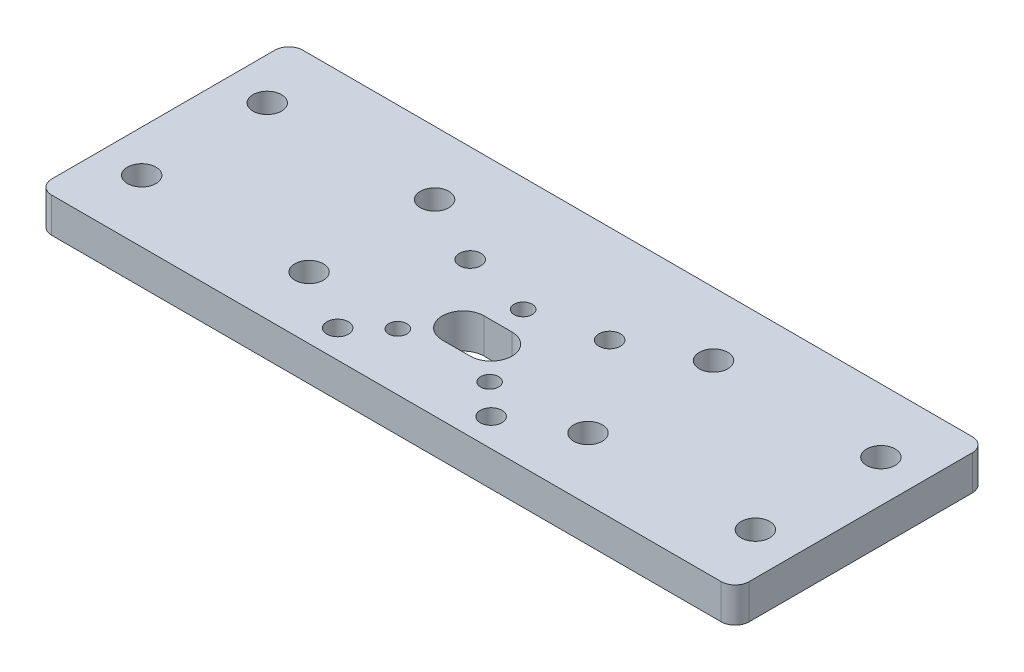
ISO-10303-21;
HEADER;
FILE_DESCRIPTION(('STEP AP214'),'2;1');
FILE_NAME('part.step','',(''),(''),'','','');
FILE_SCHEMA(('AUTOMOTIVE_DESIGN { 1 0 10303 214 1 1 1 1 }'));
ENDSEC;
DATA;
#1=APPLICATION_CONTEXT('core data for automotive mechanical design processes');
#2=APPLICATION_PROTOCOL_DEFINITION('international standard','automotive_design',2000,#1);
#3=PRODUCT_CONTEXT('',#1,'mechanical');
#4=PRODUCT('Part','Part','',(#3));
#5=PRODUCT_RELATED_PRODUCT_CATEGORY('part','',(#4));
#6=PRODUCT_DEFINITION_FORMATION('','',#4);
#7=PRODUCT_DEFINITION_CONTEXT('part definition',#1,'design');
#8=PRODUCT_DEFINITION('design','',#6,#7);
#9=PRODUCT_DEFINITION_SHAPE('','',#8);
#10=(LENGTH_UNIT() NAMED_UNIT(*) SI_UNIT(.MILLI.,.METRE.));
#11=(NAMED_UNIT(*) PLANE_ANGLE_UNIT() SI_UNIT($,.RADIAN.));
#12=(NAMED_UNIT(*) SI_UNIT($,.STERADIAN.) SOLID_ANGLE_UNIT());
#13=UNCERTAINTY_MEASURE_WITH_UNIT(LENGTH_MEASURE(1.E-05),#10,'distance_accuracy_value','');
#14=(GEOMETRIC_REPRESENTATION_CONTEXT(3) GLOBAL_UNCERTAINTY_ASSIGNED_CONTEXT((#13)) GLOBAL_UNIT_ASSIGNED_CONTEXT((#10,
#11,#12)) REPRESENTATION_CONTEXT('',''));
#15=CARTESIAN_POINT('',(0.,0.,0.));
#16=DIRECTION('',(0.,0.,1.));
#17=DIRECTION('',(1.,0.,0.));
#18=AXIS2_PLACEMENT_3D('',#15,#16,#17);
#19=CARTESIAN_POINT('',(48.,5.,-22.));
#20=DIRECTION('',(0.,-1.,0.));
#21=DIRECTION('',(0.,0.,-1.));
#22=AXIS2_PLACEMENT_3D('',#19,#20,#21);
#23=PLANE('',#22);
#24=CARTESIAN_POINT('',(20.,5.,3.10000000000003));
#25=DIRECTION('',(0.,1.,0.));
#26=DIRECTION('',(0.,0.,1.));
#27=AXIS2_PLACEMENT_3D('',#24,#25,#26);
#28=CIRCLE('',#27,2.05);
#29=CARTESIAN_POINT('',(20.,5.,5.15000000000003));
#30=VERTEX_POINT('',#29);
#31=EDGE_CURVE('E167',#30,#30,#28,.T.);
#32=ORIENTED_EDGE('',*,*,#31,.F.);
#33=EDGE_LOOP('',(#32));
#34=FACE_BOUND('',#33,.T.);
#35=CARTESIAN_POINT('',(44.,5.,3.10000000000003));
#36=DIRECTION('',(0.,1.,0.));
#37=DIRECTION('',(0.,0.,1.));
#38=AXIS2_PLACEMENT_3D('',#35,#36,#37);
#39=CIRCLE('',#38,2.05);
#40=CARTESIAN_POINT('',(44.,5.,5.15000000000003));
#41=VERTEX_POINT('',#40);
#42=EDGE_CURVE('E173',#41,#41,#39,.T.);
#43=ORIENTED_EDGE('',*,*,#42,.F.);
#44=EDGE_LOOP('',(#43));
#45=FACE_BOUND('',#44,.T.);
#46=CARTESIAN_POINT('',(20.,5.,-14.9));
#47=DIRECTION('',(0.,1.,0.));
#48=DIRECTION('',(0.,0.,1.));
#49=AXIS2_PLACEMENT_3D('',#46,#47,#48);
#50=CIRCLE('',#49,2.05);
#51=CARTESIAN_POINT('',(20.,5.,-12.85));
#52=VERTEX_POINT('',#51);
#53=EDGE_CURVE('E179',#52,#52,#50,.T.);
#54=ORIENTED_EDGE('',*,*,#53,.F.);
#55=EDGE_LOOP('',(#54));
#56=FACE_BOUND('',#55,.T.);
#57=CARTESIAN_POINT('',(-6.58179306876172,5.,3.80000000000003));
#58=DIRECTION('',(0.,1.,0.));
#59=DIRECTION('',(0.,0.,-1.));
#60=AXIS2_PLACEMENT_3D('',#57,#58,#59);
#61=CIRCLE('',#60,1.3);
#62=CARTESIAN_POINT('',(-6.58179306876172,5.,2.50000000000003));
#63=VERTEX_POINT('',#62);
#64=EDGE_CURVE('E185',#63,#63,#61,.T.);
#65=ORIENTED_EDGE('',*,*,#64,.F.);
#66=EDGE_LOOP('',(#65));
#67=FACE_BOUND('',#66,.T.);
#68=CARTESIAN_POINT('',(6.58179306876172,5.,3.80000000000003));
#69=DIRECTION('',(0.,1.,0.));
#70=DIRECTION('',(0.,0.,1.));
#71=AXIS2_PLACEMENT_3D('',#68,#69,#70);
#72=CIRCLE('',#71,1.3);
#73=CARTESIAN_POINT('',(6.58179306876172,5.,5.10000000000003));
#74=VERTEX_POINT('',#73);
#75=EDGE_CURVE('E191',#74,#74,#72,.T.);
#76=ORIENTED_EDGE('',*,*,#75,.F.);
#77=EDGE_LOOP('',(#76));
#78=FACE_BOUND('',#77,.T.);
#79=CARTESIAN_POINT('',(0.,5.,-7.6));
#80=DIRECTION('',(0.,1.,0.));
#81=DIRECTION('',(0.,0.,1.));
#82=AXIS2_PLACEMENT_3D('',#79,#80,#81);
#83=CIRCLE('',#82,1.3);
#84=CARTESIAN_POINT('',(0.,5.,-6.3));
#85=VERTEX_POINT('',#84);
#86=EDGE_CURVE('E197',#85,#85,#83,.T.);
#87=ORIENTED_EDGE('',*,*,#86,.F.);
#88=EDGE_LOOP('',(#87));
#89=FACE_BOUND('',#88,.T.);
#90=CARTESIAN_POINT('',(44.,5.,-14.9));
#91=DIRECTION('',(0.,1.,0.));
#92=DIRECTION('',(0.,0.,1.));
#93=AXIS2_PLACEMENT_3D('',#90,#91,#92);
#94=CIRCLE('',#93,2.05);
#95=CARTESIAN_POINT('',(44.,5.,-12.85));
#96=VERTEX_POINT('',#95);
#97=EDGE_CURVE('E203',#96,#96,#94,.T.);
#98=ORIENTED_EDGE('',*,*,#97,.F.);
#99=EDGE_LOOP('',(#98));
#100=FACE_BOUND('',#99,.T.);
#101=CARTESIAN_POINT('',(48.,5.,-22.));
#102=DIRECTION('',(0.,1.,0.));
#103=DIRECTION('',(0.,0.,-1.));
#104=AXIS2_PLACEMENT_3D('',#101,#102,#103);
#105=CIRCLE('',#104,2.);
#106=CARTESIAN_POINT('',(50.,5.,-22.));
#107=VERTEX_POINT('',#106);
#108=CARTESIAN_POINT('',(48.,5.,-24.));
#109=VERTEX_POINT('',#108);
#110=EDGE_CURVE('E209',#107,#109,#105,.T.);
#111=ORIENTED_EDGE('',*,*,#110,.T.);
#112=DIRECTION('',(-1.,0.,0.));
#113=VECTOR('',#112,1.);
#114=CARTESIAN_POINT('',(-48.,5.,-24.));
#115=LINE('',#114,#113);
#116=CARTESIAN_POINT('',(-48.,5.,-24.));
#117=VERTEX_POINT('',#116);
#118=EDGE_CURVE('E212',#109,#117,#115,.T.);
#119=ORIENTED_EDGE('',*,*,#118,.T.);
#120=CARTESIAN_POINT('',(-48.,5.,-22.));
#121=DIRECTION('',(0.,1.,0.));
#122=DIRECTION('',(0.,0.,-1.));
#123=AXIS2_PLACEMENT_3D('',#120,#121,#122);
#124=CIRCLE('',#123,2.);
#125=CARTESIAN_POINT('',(-50.,5.,-22.));
#126=VERTEX_POINT('',#125);
#127=EDGE_CURVE('E215',#117,#126,#124,.T.);
#128=ORIENTED_EDGE('',*,*,#127,.T.);
#129=DIRECTION('',(0.,0.,1.));
#130=VECTOR('',#129,1.);
#131=CARTESIAN_POINT('',(-50.,5.,10.));
#132=LINE('',#131,#130);
#133=CARTESIAN_POINT('',(-50.,5.,10.));
#134=VERTEX_POINT('',#133);
#135=EDGE_CURVE('E217',#126,#134,#132,.T.);
#136=ORIENTED_EDGE('',*,*,#135,.T.);
#137=CARTESIAN_POINT('',(-48.,5.,10.));
#138=DIRECTION('',(0.,1.,0.));
#139=DIRECTION('',(0.,0.,-1.));
#140=AXIS2_PLACEMENT_3D('',#137,#138,#139);
#141=CIRCLE('',#140,2.);
#142=CARTESIAN_POINT('',(-48.,5.,12.));
#143=VERTEX_POINT('',#142);
#144=EDGE_CURVE('E219',#134,#143,#141,.T.);
#145=ORIENTED_EDGE('',*,*,#144,.T.);
#146=DIRECTION('',(1.,0.,0.));
#147=VECTOR('',#146,1.);
#148=CARTESIAN_POINT('',(-48.,5.,12.));
#149=LINE('',#148,#147);
#150=CARTESIAN_POINT('',(48.,5.,12.));
#151=VERTEX_POINT('',#150);
#152=EDGE_CURVE('E221',#143,#151,#149,.T.);
#153=ORIENTED_EDGE('',*,*,#152,.T.);
#154=CARTESIAN_POINT('',(48.,5.,10.));
#155=DIRECTION('',(0.,1.,0.));
#156=DIRECTION('',(0.,0.,1.));
#157=AXIS2_PLACEMENT_3D('',#154,#155,#156);
#158=CIRCLE('',#157,2.);
#159=CARTESIAN_POINT('',(50.,5.,10.));
#160=VERTEX_POINT('',#159);
#161=EDGE_CURVE('E223',#151,#160,#158,.T.);
#162=ORIENTED_EDGE('',*,*,#161,.T.);
#163=DIRECTION('',(0.,0.,-1.));
#164=VECTOR('',#163,1.);
#165=CARTESIAN_POINT('',(50.,5.,10.));
#166=LINE('',#165,#164);
#167=EDGE_CURVE('E225',#160,#107,#166,.T.);
#168=ORIENTED_EDGE('',*,*,#167,.T.);
#169=EDGE_LOOP('',(#111,#119,#128,#136,#145,#153,#162,#168));
#170=FACE_BOUND('',#169,.T.);
#171=CARTESIAN_POINT('',(2.,5.,-1.));
#172=DIRECTION('',(0.,1.,0.));
#173=DIRECTION('',(0.,0.,1.));
#174=AXIS2_PLACEMENT_3D('',#171,#172,#173);
#175=CIRCLE('',#174,3.);
#176=CARTESIAN_POINT('',(2.,5.,2.));
#177=VERTEX_POINT('',#176);
#178=CARTESIAN_POINT('',(2.,5.,-4.));
#179=VERTEX_POINT('',#178);
#180=EDGE_CURVE('E128',#177,#179,#175,.T.);
#181=ORIENTED_EDGE('',*,*,#180,.F.);
#182=DIRECTION('',(1.,0.,0.));
#183=VECTOR('',#182,1.);
#184=CARTESIAN_POINT('',(2.,5.,2.));
#185=LINE('',#184,#183);
#186=CARTESIAN_POINT('',(-1.99999999999999,5.,2.));
#187=VERTEX_POINT('',#186);
#188=EDGE_CURVE('E151',#187,#177,#185,.T.);
#189=ORIENTED_EDGE('',*,*,#188,.F.);
#190=CARTESIAN_POINT('',(-2.,5.,-1.));
#191=DIRECTION('',(0.,1.,0.));
#192=DIRECTION('',(0.,0.,-1.));
#193=AXIS2_PLACEMENT_3D('',#190,#191,#192);
#194=CIRCLE('',#193,3.);
#195=CARTESIAN_POINT('',(-2.,5.,-4.));
#196=VERTEX_POINT('',#195);
#197=EDGE_CURVE('E149',#196,#187,#194,.T.);
#198=ORIENTED_EDGE('',*,*,#197,.F.);
#199=DIRECTION('',(-1.,0.,0.));
#200=VECTOR('',#199,1.);
#201=CARTESIAN_POINT('',(2.,5.,-4.));
#202=LINE('',#201,#200);
#203=EDGE_CURVE('E136',#179,#196,#202,.T.);
#204=ORIENTED_EDGE('',*,*,#203,.F.);
#205=EDGE_LOOP('',(#181,#189,#198,#204));
#206=FACE_BOUND('',#205,.T.);
#207=CARTESIAN_POINT('',(-44.,5.,3.10000000000003));
#208=DIRECTION('',(0.,1.,0.));
#209=DIRECTION('',(0.,0.,-1.));
#210=AXIS2_PLACEMENT_3D('',#207,#208,#209);
#211=CIRCLE('',#210,2.05);
#212=CARTESIAN_POINT('',(-44.,5.,1.05000000000003));
#213=VERTEX_POINT('',#212);
#214=EDGE_CURVE('E157',#213,#213,#211,.T.);
#215=ORIENTED_EDGE('',*,*,#214,.F.);
#216=EDGE_LOOP('',(#215));
#217=FACE_BOUND('',#216,.T.);
#218=CARTESIAN_POINT('',(-20.,5.,3.10000000000003));
#219=DIRECTION('',(0.,1.,0.));
#220=DIRECTION('',(0.,0.,-1.));
#221=AXIS2_PLACEMENT_3D('',#218,#219,#220);
#222=CIRCLE('',#221,2.05);
#223=CARTESIAN_POINT('',(-20.,5.,1.05000000000003));
#224=VERTEX_POINT('',#223);
#225=EDGE_CURVE('E392',#224,#224,#222,.T.);
#226=ORIENTED_EDGE('',*,*,#225,.F.);
#227=EDGE_LOOP('',(#226));
#228=FACE_BOUND('',#227,.T.);
#229=CARTESIAN_POINT('',(-20.,5.,-14.9));
#230=DIRECTION('',(0.,1.,0.));
#231=DIRECTION('',(0.,0.,-1.));
#232=AXIS2_PLACEMENT_3D('',#229,#230,#231);
#233=CIRCLE('',#232,2.05);
#234=CARTESIAN_POINT('',(-20.,5.,-16.95));
#235=VERTEX_POINT('',#234);
#236=EDGE_CURVE('E387',#235,#235,#233,.T.);
#237=ORIENTED_EDGE('',*,*,#236,.F.);
#238=EDGE_LOOP('',(#237));
#239=FACE_BOUND('',#238,.T.);
#240=CARTESIAN_POINT('',(-44.,5.,-14.9));
#241=DIRECTION('',(0.,1.,0.));
#242=DIRECTION('',(0.,0.,-1.));
#243=AXIS2_PLACEMENT_3D('',#240,#241,#242);
#244=CIRCLE('',#243,2.05);
#245=CARTESIAN_POINT('',(-44.,5.,-16.95));
#246=VERTEX_POINT('',#245);
#247=EDGE_CURVE('E382',#246,#246,#244,.T.);
#248=ORIENTED_EDGE('',*,*,#247,.F.);
#249=EDGE_LOOP('',(#248));
#250=FACE_BOUND('',#249,.T.);
#251=CARTESIAN_POINT('',(11.,5.,8.));
#252=DIRECTION('',(0.,1.,0.));
#253=DIRECTION('',(0.,0.,1.));
#254=AXIS2_PLACEMENT_3D('',#251,#252,#253);
#255=CIRCLE('',#254,1.55);
#256=CARTESIAN_POINT('',(11.,5.,9.55));
#257=VERTEX_POINT('',#256);
#258=EDGE_CURVE('E377',#257,#257,#255,.T.);
#259=ORIENTED_EDGE('',*,*,#258,.F.);
#260=EDGE_LOOP('',(#259));
#261=FACE_BOUND('',#260,.T.);
#262=CARTESIAN_POINT('',(10.,5.,-10.));
#263=DIRECTION('',(0.,1.,0.));
#264=DIRECTION('',(0.,0.,1.));
#265=AXIS2_PLACEMENT_3D('',#262,#263,#264);
#266=CIRCLE('',#265,1.55);
#267=CARTESIAN_POINT('',(10.,5.,-8.45));
#268=VERTEX_POINT('',#267);
#269=EDGE_CURVE('E372',#268,#268,#266,.T.);
#270=ORIENTED_EDGE('',*,*,#269,.F.);
#271=EDGE_LOOP('',(#270));
#272=FACE_BOUND('',#271,.T.);
#273=CARTESIAN_POINT('',(-11.,5.,8.));
#274=DIRECTION('',(0.,1.,0.));
#275=DIRECTION('',(0.,0.,-1.));
#276=AXIS2_PLACEMENT_3D('',#273,#274,#275);
#277=CIRCLE('',#276,1.55);
#278=CARTESIAN_POINT('',(-11.,5.,6.45));
#279=VERTEX_POINT('',#278);
#280=EDGE_CURVE('E367',#279,#279,#277,.T.);
#281=ORIENTED_EDGE('',*,*,#280,.F.);
#282=EDGE_LOOP('',(#281));
#283=FACE_BOUND('',#282,.T.);
#284=CARTESIAN_POINT('',(-10.,5.,-10.));
#285=DIRECTION('',(0.,1.,0.));
#286=DIRECTION('',(0.,0.,-1.));
#287=AXIS2_PLACEMENT_3D('',#284,#285,#286);
#288=CIRCLE('',#287,1.55);
#289=CARTESIAN_POINT('',(-10.,5.,-11.55));
#290=VERTEX_POINT('',#289);
#291=EDGE_CURVE('E361',#290,#290,#288,.T.);
#292=ORIENTED_EDGE('',*,*,#291,.F.);
#293=EDGE_LOOP('',(#292));
#294=FACE_BOUND('',#293,.T.);
#295=ADVANCED_FACE('F39',(#34,#45,#56,#67,#78,#89,#100,#170,#206,#217,#228,#239,#250,#261,#272,
#283,#294),#23,.F.);
#296=CARTESIAN_POINT('',(48.,0.,-22.));
#297=DIRECTION('',(0.,-1.,0.));
#298=DIRECTION('',(0.,0.,-1.));
#299=AXIS2_PLACEMENT_3D('',#296,#297,#298);
#300=PLANE('',#299);
#301=CARTESIAN_POINT('',(-11.,0.,8.));
#302=DIRECTION('',(0.,1.,0.));
#303=DIRECTION('',(0.,0.,-1.));
#304=AXIS2_PLACEMENT_3D('',#301,#302,#303);
#305=CIRCLE('',#304,1.55);
#306=CARTESIAN_POINT('',(-11.,0.,6.45));
#307=VERTEX_POINT('',#306);
#308=EDGE_CURVE('E364',#307,#307,#305,.T.);
#309=ORIENTED_EDGE('',*,*,#308,.T.);
#310=EDGE_LOOP('',(#309));
#311=FACE_BOUND('',#310,.T.);
#312=CARTESIAN_POINT('',(11.,0.,8.));
#313=DIRECTION('',(0.,1.,0.));
#314=DIRECTION('',(0.,0.,1.));
#315=AXIS2_PLACEMENT_3D('',#312,#313,#314);
#316=CIRCLE('',#315,1.55);
#317=CARTESIAN_POINT('',(11.,0.,9.55));
#318=VERTEX_POINT('',#317);
#319=EDGE_CURVE('E375',#318,#318,#316,.T.);
#320=ORIENTED_EDGE('',*,*,#319,.T.);
#321=EDGE_LOOP('',(#320));
#322=FACE_BOUND('',#321,.T.);
#323=CARTESIAN_POINT('',(-20.,0.,-14.9));
#324=DIRECTION('',(0.,1.,0.));
#325=DIRECTION('',(0.,0.,-1.));
#326=AXIS2_PLACEMENT_3D('',#323,#324,#325);
#327=CIRCLE('',#326,2.05);
#328=CARTESIAN_POINT('',(-20.,0.,-16.95));
#329=VERTEX_POINT('',#328);
#330=EDGE_CURVE('E385',#329,#329,#327,.T.);
#331=ORIENTED_EDGE('',*,*,#330,.T.);
#332=EDGE_LOOP('',(#331));
#333=FACE_BOUND('',#332,.T.);
#334=CARTESIAN_POINT('',(-44.,0.,3.10000000000003));
#335=DIRECTION('',(0.,1.,0.));
#336=DIRECTION('',(0.,0.,-1.));
#337=AXIS2_PLACEMENT_3D('',#334,#335,#336);
#338=CIRCLE('',#337,2.05);
#339=CARTESIAN_POINT('',(-44.,0.,1.05000000000003));
#340=VERTEX_POINT('',#339);
#341=EDGE_CURVE('E395',#340,#340,#338,.T.);
#342=ORIENTED_EDGE('',*,*,#341,.T.);
#343=EDGE_LOOP('',(#342));
#344=FACE_BOUND('',#343,.T.);
#345=CARTESIAN_POINT('',(44.,0.,3.10000000000003));
#346=DIRECTION('',(0.,1.,0.));
#347=DIRECTION('',(0.,0.,1.));
#348=AXIS2_PLACEMENT_3D('',#345,#346,#347);
#349=CIRCLE('',#348,2.05);
#350=CARTESIAN_POINT('',(44.,0.,5.15000000000003));
#351=VERTEX_POINT('',#350);
#352=EDGE_CURVE('E170',#351,#351,#349,.T.);
#353=ORIENTED_EDGE('',*,*,#352,.T.);
#354=EDGE_LOOP('',(#353));
#355=FACE_BOUND('',#354,.T.);
#356=CARTESIAN_POINT('',(-6.58179306876172,0.,3.80000000000003));
#357=DIRECTION('',(0.,1.,0.));
#358=DIRECTION('',(0.,0.,-1.));
#359=AXIS2_PLACEMENT_3D('',#356,#357,#358);
#360=CIRCLE('',#359,1.3);
#361=CARTESIAN_POINT('',(-6.58179306876172,0.,2.50000000000003));
#362=VERTEX_POINT('',#361);
#363=EDGE_CURVE('E182',#362,#362,#360,.T.);
#364=ORIENTED_EDGE('',*,*,#363,.T.);
#365=EDGE_LOOP('',(#364));
#366=FACE_BOUND('',#365,.T.);
#367=CARTESIAN_POINT('',(0.,0.,-7.6));
#368=DIRECTION('',(0.,1.,0.));
#369=DIRECTION('',(0.,0.,1.));
#370=AXIS2_PLACEMENT_3D('',#367,#368,#369);
#371=CIRCLE('',#370,1.3);
#372=CARTESIAN_POINT('',(0.,0.,-6.3));
#373=VERTEX_POINT('',#372);
#374=EDGE_CURVE('E194',#373,#373,#371,.T.);
#375=ORIENTED_EDGE('',*,*,#374,.T.);
#376=EDGE_LOOP('',(#375));
#377=FACE_BOUND('',#376,.T.);
#378=CARTESIAN_POINT('',(48.,0.,-22.));
#379=DIRECTION('',(0.,1.,0.));
#380=DIRECTION('',(0.,0.,-1.));
#381=AXIS2_PLACEMENT_3D('',#378,#379,#380);
#382=CIRCLE('',#381,2.);
#383=CARTESIAN_POINT('',(50.,0.,-22.));
#384=VERTEX_POINT('',#383);
#385=CARTESIAN_POINT('',(48.,0.,-24.));
#386=VERTEX_POINT('',#385);
#387=EDGE_CURVE('E206',#384,#386,#382,.T.);
#388=ORIENTED_EDGE('',*,*,#387,.F.);
#389=DIRECTION('',(0.,0.,-1.));
#390=VECTOR('',#389,1.);
#391=CARTESIAN_POINT('',(50.,0.,10.));
#392=LINE('',#391,#390);
#393=CARTESIAN_POINT('',(50.,0.,10.));
#394=VERTEX_POINT('',#393);
#395=EDGE_CURVE('E213',#394,#384,#392,.T.);
#396=ORIENTED_EDGE('',*,*,#395,.F.);
#397=CARTESIAN_POINT('',(48.,0.,10.));
#398=DIRECTION('',(0.,1.,0.));
#399=DIRECTION('',(0.,0.,1.));
#400=AXIS2_PLACEMENT_3D('',#397,#398,#399);
#401=CIRCLE('',#400,2.);
#402=CARTESIAN_POINT('',(48.,0.,12.));
#403=VERTEX_POINT('',#402);
#404=EDGE_CURVE('E240',#403,#394,#401,.T.);
#405=ORIENTED_EDGE('',*,*,#404,.F.);
#406=DIRECTION('',(1.,0.,0.));
#407=VECTOR('',#406,1.);
#408=CARTESIAN_POINT('',(-48.,0.,12.));
#409=LINE('',#408,#407);
#410=CARTESIAN_POINT('',(-48.,0.,12.));
#411=VERTEX_POINT('',#410);
#412=EDGE_CURVE('E238',#411,#403,#409,.T.);
#413=ORIENTED_EDGE('',*,*,#412,.F.);
#414=CARTESIAN_POINT('',(-48.,0.,10.));
#415=DIRECTION('',(0.,1.,0.));
#416=DIRECTION('',(0.,0.,-1.));
#417=AXIS2_PLACEMENT_3D('',#414,#415,#416);
#418=CIRCLE('',#417,2.);
#419=CARTESIAN_POINT('',(-50.,0.,10.));
#420=VERTEX_POINT('',#419);
#421=EDGE_CURVE('E236',#420,#411,#418,.T.);
#422=ORIENTED_EDGE('',*,*,#421,.F.);
#423=DIRECTION('',(0.,0.,1.));
#424=VECTOR('',#423,1.);
#425=CARTESIAN_POINT('',(-50.,0.,10.));
#426=LINE('',#425,#424);
#427=CARTESIAN_POINT('',(-50.,0.,-22.));
#428=VERTEX_POINT('',#427);
#429=EDGE_CURVE('E234',#428,#420,#426,.T.);
#430=ORIENTED_EDGE('',*,*,#429,.F.);
#431=CARTESIAN_POINT('',(-48.,0.,-22.));
#432=DIRECTION('',(0.,1.,0.));
#433=DIRECTION('',(0.,0.,-1.));
#434=AXIS2_PLACEMENT_3D('',#431,#432,#433);
#435=CIRCLE('',#434,2.);
#436=CARTESIAN_POINT('',(-48.,0.,-24.));
#437=VERTEX_POINT('',#436);
#438=EDGE_CURVE('E232',#437,#428,#435,.T.);
#439=ORIENTED_EDGE('',*,*,#438,.F.);
#440=DIRECTION('',(-1.,0.,0.));
#441=VECTOR('',#440,1.);
#442=CARTESIAN_POINT('',(-48.,0.,-24.));
#443=LINE('',#442,#441);
#444=EDGE_CURVE('E230',#386,#437,#443,.T.);
#445=ORIENTED_EDGE('',*,*,#444,.F.);
#446=EDGE_LOOP('',(#388,#396,#405,#413,#422,#430,#439,#445));
#447=FACE_BOUND('',#446,.T.);
#448=CARTESIAN_POINT('',(44.,0.,-14.9));
#449=DIRECTION('',(0.,1.,0.));
#450=DIRECTION('',(0.,0.,1.));
#451=AXIS2_PLACEMENT_3D('',#448,#449,#450);
#452=CIRCLE('',#451,2.05);
#453=CARTESIAN_POINT('',(44.,0.,-12.85));
#454=VERTEX_POINT('',#453);
#455=EDGE_CURVE('E200',#454,#454,#452,.T.);
#456=ORIENTED_EDGE('',*,*,#455,.T.);
#457=EDGE_LOOP('',(#456));
#458=FACE_BOUND('',#457,.T.);
#459=CARTESIAN_POINT('',(6.58179306876172,0.,3.80000000000003));
#460=DIRECTION('',(0.,1.,0.));
#461=DIRECTION('',(0.,0.,1.));
#462=AXIS2_PLACEMENT_3D('',#459,#460,#461);
#463=CIRCLE('',#462,1.3);
#464=CARTESIAN_POINT('',(6.58179306876172,0.,5.10000000000003));
#465=VERTEX_POINT('',#464);
#466=EDGE_CURVE('E188',#465,#465,#463,.T.);
#467=ORIENTED_EDGE('',*,*,#466,.T.);
#468=EDGE_LOOP('',(#467));
#469=FACE_BOUND('',#468,.T.);
#470=CARTESIAN_POINT('',(20.,0.,-14.9));
#471=DIRECTION('',(0.,1.,0.));
#472=DIRECTION('',(0.,0.,1.));
#473=AXIS2_PLACEMENT_3D('',#470,#471,#472);
#474=CIRCLE('',#473,2.05);
#475=CARTESIAN_POINT('',(20.,0.,-12.85));
#476=VERTEX_POINT('',#475);
#477=EDGE_CURVE('E176',#476,#476,#474,.T.);
#478=ORIENTED_EDGE('',*,*,#477,.T.);
#479=EDGE_LOOP('',(#478));
#480=FACE_BOUND('',#479,.T.);
#481=CARTESIAN_POINT('',(20.,0.,3.10000000000003));
#482=DIRECTION('',(0.,1.,0.));
#483=DIRECTION('',(0.,0.,1.));
#484=AXIS2_PLACEMENT_3D('',#481,#482,#483);
#485=CIRCLE('',#484,2.05);
#486=CARTESIAN_POINT('',(20.,0.,5.15000000000003));
#487=VERTEX_POINT('',#486);
#488=EDGE_CURVE('E144',#487,#487,#485,.T.);
#489=ORIENTED_EDGE('',*,*,#488,.T.);
#490=EDGE_LOOP('',(#489));
#491=FACE_BOUND('',#490,.T.);
#492=DIRECTION('',(1.,0.,0.));
#493=VECTOR('',#492,1.);
#494=CARTESIAN_POINT('',(2.,0.,2.));
#495=LINE('',#494,#493);
#496=CARTESIAN_POINT('',(-2.,0.,2.));
#497=VERTEX_POINT('',#496);
#498=CARTESIAN_POINT('',(2.,0.,2.));
#499=VERTEX_POINT('',#498);
#500=EDGE_CURVE('E137',#497,#499,#495,.T.);
#501=ORIENTED_EDGE('',*,*,#500,.T.);
#502=CARTESIAN_POINT('',(2.,0.,-1.));
#503=DIRECTION('',(0.,1.,0.));
#504=DIRECTION('',(0.,0.,1.));
#505=AXIS2_PLACEMENT_3D('',#502,#503,#504);
#506=CIRCLE('',#505,3.);
#507=CARTESIAN_POINT('',(2.,0.,-4.));
#508=VERTEX_POINT('',#507);
#509=EDGE_CURVE('E62',#499,#508,#506,.T.);
#510=ORIENTED_EDGE('',*,*,#509,.T.);
#511=DIRECTION('',(-1.,0.,0.));
#512=VECTOR('',#511,1.);
#513=CARTESIAN_POINT('',(2.,0.,-4.));
#514=LINE('',#513,#512);
#515=CARTESIAN_POINT('',(-2.,0.,-4.));
#516=VERTEX_POINT('',#515);
#517=EDGE_CURVE('E143',#508,#516,#514,.T.);
#518=ORIENTED_EDGE('',*,*,#517,.T.);
#519=CARTESIAN_POINT('',(-2.,0.,-1.));
#520=DIRECTION('',(0.,1.,0.));
#521=DIRECTION('',(0.,0.,-1.));
#522=AXIS2_PLACEMENT_3D('',#519,#520,#521);
#523=CIRCLE('',#522,3.);
#524=EDGE_CURVE('E159',#516,#497,#523,.T.);
#525=ORIENTED_EDGE('',*,*,#524,.T.);
#526=EDGE_LOOP('',(#501,#510,#518,#525));
#527=FACE_BOUND('',#526,.T.);
#528=CARTESIAN_POINT('',(-20.,0.,3.10000000000003));
#529=DIRECTION('',(0.,1.,0.));
#530=DIRECTION('',(0.,0.,-1.));
#531=AXIS2_PLACEMENT_3D('',#528,#529,#530);
#532=CIRCLE('',#531,2.05);
#533=CARTESIAN_POINT('',(-20.,0.,1.05000000000003));
#534=VERTEX_POINT('',#533);
#535=EDGE_CURVE('E348',#534,#534,#532,.T.);
#536=ORIENTED_EDGE('',*,*,#535,.T.);
#537=EDGE_LOOP('',(#536));
#538=FACE_BOUND('',#537,.T.);
#539=CARTESIAN_POINT('',(-44.,0.,-14.9));
#540=DIRECTION('',(0.,1.,0.));
#541=DIRECTION('',(0.,0.,-1.));
#542=AXIS2_PLACEMENT_3D('',#539,#540,#541);
#543=CIRCLE('',#542,2.05);
#544=CARTESIAN_POINT('',(-44.,0.,-16.95));
#545=VERTEX_POINT('',#544);
#546=EDGE_CURVE('E352',#545,#545,#543,.T.);
#547=ORIENTED_EDGE('',*,*,#546,.T.);
#548=EDGE_LOOP('',(#547));
#549=FACE_BOUND('',#548,.T.);
#550=CARTESIAN_POINT('',(10.,0.,-10.));
#551=DIRECTION('',(0.,1.,0.));
#552=DIRECTION('',(0.,0.,1.));
#553=AXIS2_PLACEMENT_3D('',#550,#551,#552);
#554=CIRCLE('',#553,1.55);
#555=CARTESIAN_POINT('',(10.,0.,-8.45));
#556=VERTEX_POINT('',#555);
#557=EDGE_CURVE('E356',#556,#556,#554,.T.);
#558=ORIENTED_EDGE('',*,*,#557,.T.);
#559=EDGE_LOOP('',(#558));
#560=FACE_BOUND('',#559,.T.);
#561=CARTESIAN_POINT('',(-10.,0.,-10.));
#562=DIRECTION('',(0.,1.,0.));
#563=DIRECTION('',(0.,0.,-1.));
#564=AXIS2_PLACEMENT_3D('',#561,#562,#563);
#565=CIRCLE('',#564,1.55);
#566=CARTESIAN_POINT('',(-10.,0.,-11.55));
#567=VERTEX_POINT('',#566);
#568=EDGE_CURVE('E359',#567,#567,#565,.T.);
#569=ORIENTED_EDGE('',*,*,#568,.T.);
#570=EDGE_LOOP('',(#569));
#571=FACE_BOUND('',#570,.T.);
#572=ADVANCED_FACE('F270',(#311,#322,#333,#344,#355,#366,#377,#447,#458,#469,#480,#491,#527,
#538,#549,#560,#571),#300,.T.);
#573=CARTESIAN_POINT('',(48.,5.,-22.));
#574=DIRECTION('',(0.,-1.,0.));
#575=DIRECTION('',(0.,0.,-1.));
#576=AXIS2_PLACEMENT_3D('',#573,#574,#575);
#577=CYLINDRICAL_SURFACE('',#576,2.);
#578=ORIENTED_EDGE('',*,*,#387,.T.);
#579=DIRECTION('',(0.,-1.,0.));
#580=VECTOR('',#579,1.);
#581=CARTESIAN_POINT('',(48.,5.,-24.));
#582=LINE('',#581,#580);
#583=EDGE_CURVE('E11',#109,#386,#582,.T.);
#584=ORIENTED_EDGE('',*,*,#583,.F.);
#585=ORIENTED_EDGE('',*,*,#110,.F.);
#586=DIRECTION('',(0.,-1.,0.));
#587=VECTOR('',#586,1.);
#588=CARTESIAN_POINT('',(50.,5.,-22.));
#589=LINE('',#588,#587);
#590=EDGE_CURVE('E227',#107,#384,#589,.T.);
#591=ORIENTED_EDGE('',*,*,#590,.T.);
#592=EDGE_LOOP('',(#578,#584,#585,#591));
#593=FACE_BOUND('',#592,.T.);
#594=ADVANCED_FACE('F41',(#593),#577,.T.);
#595=CARTESIAN_POINT('',(-48.,5.,-24.));
#596=DIRECTION('',(0.,0.,1.));
#597=DIRECTION('',(1.,0.,0.));
#598=AXIS2_PLACEMENT_3D('',#595,#596,#597);
#599=PLANE('',#598);
#600=ORIENTED_EDGE('',*,*,#444,.T.);
#601=DIRECTION('',(0.,-1.,0.));
#602=VECTOR('',#601,1.);
#603=CARTESIAN_POINT('',(-48.,5.,-24.));
#604=LINE('',#603,#602);
#605=EDGE_CURVE('E47',#117,#437,#604,.T.);
#606=ORIENTED_EDGE('',*,*,#605,.F.);
#607=ORIENTED_EDGE('',*,*,#118,.F.);
#608=ORIENTED_EDGE('',*,*,#583,.T.);
#609=EDGE_LOOP('',(#600,#606,#607,#608));
#610=FACE_BOUND('',#609,.T.);
#611=ADVANCED_FACE('F287',(#610),#599,.F.);
#612=CARTESIAN_POINT('',(-48.,5.,-22.));
#613=DIRECTION('',(0.,-1.,0.));
#614=DIRECTION('',(0.,0.,-1.));
#615=AXIS2_PLACEMENT_3D('',#612,#613,#614);
#616=CYLINDRICAL_SURFACE('',#615,2.);
#617=ORIENTED_EDGE('',*,*,#438,.T.);
#618=DIRECTION('',(0.,-1.,0.));
#619=VECTOR('',#618,1.);
#620=CARTESIAN_POINT('',(-50.,5.,-22.));
#621=LINE('',#620,#619);
#622=EDGE_CURVE('E257',#126,#428,#621,.T.);
#623=ORIENTED_EDGE('',*,*,#622,.F.);
#624=ORIENTED_EDGE('',*,*,#127,.F.);
#625=ORIENTED_EDGE('',*,*,#605,.T.);
#626=EDGE_LOOP('',(#617,#623,#624,#625));
#627=FACE_BOUND('',#626,.T.);
#628=ADVANCED_FACE('F264',(#627),#616,.T.);
#629=CARTESIAN_POINT('',(-50.,5.,10.));
#630=DIRECTION('',(1.,0.,0.));
#631=DIRECTION('',(0.,0.,-1.));
#632=AXIS2_PLACEMENT_3D('',#629,#630,#631);
#633=PLANE('',#632);
#634=ORIENTED_EDGE('',*,*,#429,.T.);
#635=DIRECTION('',(0.,-1.,0.));
#636=VECTOR('',#635,1.);
#637=CARTESIAN_POINT('',(-50.,5.,10.));
#638=LINE('',#637,#636);
#639=EDGE_CURVE('E254',#134,#420,#638,.T.);
#640=ORIENTED_EDGE('',*,*,#639,.F.);
#641=ORIENTED_EDGE('',*,*,#135,.F.);
#642=ORIENTED_EDGE('',*,*,#622,.T.);
#643=EDGE_LOOP('',(#634,#640,#641,#642));
#644=FACE_BOUND('',#643,.T.);
#645=ADVANCED_FACE('F276',(#644),#633,.F.);
#646=CARTESIAN_POINT('',(-48.,5.,10.));
#647=DIRECTION('',(0.,-1.,0.));
#648=DIRECTION('',(0.,0.,-1.));
#649=AXIS2_PLACEMENT_3D('',#646,#647,#648);
#650=CYLINDRICAL_SURFACE('',#649,2.);
#651=ORIENTED_EDGE('',*,*,#421,.T.);
#652=DIRECTION('',(0.,-1.,0.));
#653=VECTOR('',#652,1.);
#654=CARTESIAN_POINT('',(-48.,5.,12.));
#655=LINE('',#654,#653);
#656=EDGE_CURVE('E251',#143,#411,#655,.T.);
#657=ORIENTED_EDGE('',*,*,#656,.F.);
#658=ORIENTED_EDGE('',*,*,#144,.F.);
#659=ORIENTED_EDGE('',*,*,#639,.T.);
#660=EDGE_LOOP('',(#651,#657,#658,#659));
#661=FACE_BOUND('',#660,.T.);
#662=ADVANCED_FACE('F280',(#661),#650,.T.);
#663=CARTESIAN_POINT('',(-48.,5.,12.));
#664=DIRECTION('',(0.,0.,-1.));
#665=DIRECTION('',(-1.,0.,0.));
#666=AXIS2_PLACEMENT_3D('',#663,#664,#665);
#667=PLANE('',#666);
#668=ORIENTED_EDGE('',*,*,#412,.T.);
#669=DIRECTION('',(0.,-1.,0.));
#670=VECTOR('',#669,1.);
#671=CARTESIAN_POINT('',(48.,5.,12.));
#672=LINE('',#671,#670);
#673=EDGE_CURVE('E248',#151,#403,#672,.T.);
#674=ORIENTED_EDGE('',*,*,#673,.F.);
#675=ORIENTED_EDGE('',*,*,#152,.F.);
#676=ORIENTED_EDGE('',*,*,#656,.T.);
#677=EDGE_LOOP('',(#668,#674,#675,#676));
#678=FACE_BOUND('',#677,.T.);
#679=ADVANCED_FACE('F300',(#678),#667,.F.);
#680=CARTESIAN_POINT('',(48.,5.,10.));
#681=DIRECTION('',(0.,-1.,0.));
#682=DIRECTION('',(0.,0.,-1.));
#683=AXIS2_PLACEMENT_3D('',#680,#681,#682);
#684=CYLINDRICAL_SURFACE('',#683,2.);
#685=ORIENTED_EDGE('',*,*,#404,.T.);
#686=DIRECTION('',(0.,-1.,0.));
#687=VECTOR('',#686,1.);
#688=CARTESIAN_POINT('',(50.,5.,10.));
#689=LINE('',#688,#687);
#690=EDGE_CURVE('E245',#160,#394,#689,.T.);
#691=ORIENTED_EDGE('',*,*,#690,.F.);
#692=ORIENTED_EDGE('',*,*,#161,.F.);
#693=ORIENTED_EDGE('',*,*,#673,.T.);
#694=EDGE_LOOP('',(#685,#691,#692,#693));
#695=FACE_BOUND('',#694,.T.);
#696=ADVANCED_FACE('F298',(#695),#684,.T.);
#697=CARTESIAN_POINT('',(50.,5.,10.));
#698=DIRECTION('',(-1.,0.,0.));
#699=DIRECTION('',(0.,0.,1.));
#700=AXIS2_PLACEMENT_3D('',#697,#698,#699);
#701=PLANE('',#700);
#702=ORIENTED_EDGE('',*,*,#395,.T.);
#703=ORIENTED_EDGE('',*,*,#590,.F.);
#704=ORIENTED_EDGE('',*,*,#167,.F.);
#705=ORIENTED_EDGE('',*,*,#690,.T.);
#706=EDGE_LOOP('',(#702,#703,#704,#705));
#707=FACE_BOUND('',#706,.T.);
#708=ADVANCED_FACE('F293',(#707),#701,.F.);
#709=CARTESIAN_POINT('',(44.,5.,-14.9));
#710=DIRECTION('',(0.,-1.,0.));
#711=DIRECTION('',(0.,0.,-1.));
#712=AXIS2_PLACEMENT_3D('',#709,#710,#711);
#713=CYLINDRICAL_SURFACE('',#712,2.05);
#714=ORIENTED_EDGE('',*,*,#97,.T.);
#715=EDGE_LOOP('',(#714));
#716=FACE_BOUND('',#715,.T.);
#717=ORIENTED_EDGE('',*,*,#455,.F.);
#718=EDGE_LOOP('',(#717));
#719=FACE_BOUND('',#718,.T.);
#720=ADVANCED_FACE('F320',(#716,#719),#713,.F.);
#721=CARTESIAN_POINT('',(0.,5.,-7.6));
#722=DIRECTION('',(0.,-1.,0.));
#723=DIRECTION('',(0.,0.,-1.));
#724=AXIS2_PLACEMENT_3D('',#721,#722,#723);
#725=CYLINDRICAL_SURFACE('',#724,1.3);
#726=ORIENTED_EDGE('',*,*,#86,.T.);
#727=EDGE_LOOP('',(#726));
#728=FACE_BOUND('',#727,.T.);
#729=ORIENTED_EDGE('',*,*,#374,.F.);
#730=EDGE_LOOP('',(#729));
#731=FACE_BOUND('',#730,.T.);
#732=ADVANCED_FACE('F327',(#728,#731),#725,.F.);
#733=CARTESIAN_POINT('',(6.58179306876172,5.,3.80000000000003));
#734=DIRECTION('',(0.,-1.,0.));
#735=DIRECTION('',(0.,0.,-1.));
#736=AXIS2_PLACEMENT_3D('',#733,#734,#735);
#737=CYLINDRICAL_SURFACE('',#736,1.3);
#738=ORIENTED_EDGE('',*,*,#75,.T.);
#739=EDGE_LOOP('',(#738));
#740=FACE_BOUND('',#739,.T.);
#741=ORIENTED_EDGE('',*,*,#466,.F.);
#742=EDGE_LOOP('',(#741));
#743=FACE_BOUND('',#742,.T.);
#744=ADVANCED_FACE('F332',(#740,#743),#737,.F.);
#745=CARTESIAN_POINT('',(-6.58179306876172,5.,3.80000000000003));
#746=DIRECTION('',(0.,-1.,0.));
#747=DIRECTION('',(0.,0.,-1.));
#748=AXIS2_PLACEMENT_3D('',#745,#746,#747);
#749=CYLINDRICAL_SURFACE('',#748,1.3);
#750=ORIENTED_EDGE('',*,*,#64,.T.);
#751=EDGE_LOOP('',(#750));
#752=FACE_BOUND('',#751,.T.);
#753=ORIENTED_EDGE('',*,*,#363,.F.);
#754=EDGE_LOOP('',(#753));
#755=FACE_BOUND('',#754,.T.);
#756=ADVANCED_FACE('F438',(#752,#755),#749,.F.);
#757=CARTESIAN_POINT('',(20.,5.,-14.9));
#758=DIRECTION('',(0.,-1.,0.));
#759=DIRECTION('',(0.,0.,-1.));
#760=AXIS2_PLACEMENT_3D('',#757,#758,#759);
#761=CYLINDRICAL_SURFACE('',#760,2.05);
#762=ORIENTED_EDGE('',*,*,#53,.T.);
#763=EDGE_LOOP('',(#762));
#764=FACE_BOUND('',#763,.T.);
#765=ORIENTED_EDGE('',*,*,#477,.F.);
#766=EDGE_LOOP('',(#765));
#767=FACE_BOUND('',#766,.T.);
#768=ADVANCED_FACE('F434',(#764,#767),#761,.F.);
#769=CARTESIAN_POINT('',(44.,5.,3.10000000000003));
#770=DIRECTION('',(0.,-1.,0.));
#771=DIRECTION('',(0.,0.,-1.));
#772=AXIS2_PLACEMENT_3D('',#769,#770,#771);
#773=CYLINDRICAL_SURFACE('',#772,2.05);
#774=ORIENTED_EDGE('',*,*,#42,.T.);
#775=EDGE_LOOP('',(#774));
#776=FACE_BOUND('',#775,.T.);
#777=ORIENTED_EDGE('',*,*,#352,.F.);
#778=EDGE_LOOP('',(#777));
#779=FACE_BOUND('',#778,.T.);
#780=ADVANCED_FACE('F430',(#776,#779),#773,.F.);
#781=CARTESIAN_POINT('',(20.,5.,3.10000000000003));
#782=DIRECTION('',(0.,-1.,0.));
#783=DIRECTION('',(0.,0.,-1.));
#784=AXIS2_PLACEMENT_3D('',#781,#782,#783);
#785=CYLINDRICAL_SURFACE('',#784,2.05);
#786=ORIENTED_EDGE('',*,*,#31,.T.);
#787=EDGE_LOOP('',(#786));
#788=FACE_BOUND('',#787,.T.);
#789=ORIENTED_EDGE('',*,*,#488,.F.);
#790=EDGE_LOOP('',(#789));
#791=FACE_BOUND('',#790,.T.);
#792=ADVANCED_FACE('F427',(#788,#791),#785,.F.);
#793=CARTESIAN_POINT('',(2.,5.,-1.));
#794=DIRECTION('',(0.,-1.,0.));
#795=DIRECTION('',(0.,0.,-1.));
#796=AXIS2_PLACEMENT_3D('',#793,#794,#795);
#797=CYLINDRICAL_SURFACE('',#796,3.);
#798=ORIENTED_EDGE('',*,*,#509,.F.);
#799=DIRECTION('',(0.,-1.,0.));
#800=VECTOR('',#799,1.);
#801=CARTESIAN_POINT('',(2.,5.,2.));
#802=LINE('',#801,#800);
#803=EDGE_CURVE('E132',#177,#499,#802,.T.);
#804=ORIENTED_EDGE('',*,*,#803,.F.);
#805=ORIENTED_EDGE('',*,*,#180,.T.);
#806=DIRECTION('',(0.,-1.,0.));
#807=VECTOR('',#806,1.);
#808=CARTESIAN_POINT('',(2.,5.,-4.));
#809=LINE('',#808,#807);
#810=EDGE_CURVE('E131',#179,#508,#809,.T.);
#811=ORIENTED_EDGE('',*,*,#810,.T.);
#812=EDGE_LOOP('',(#798,#804,#805,#811));
#813=FACE_BOUND('',#812,.T.);
#814=ADVANCED_FACE('F130',(#813),#797,.F.);
#815=CARTESIAN_POINT('',(2.,5.,-4.));
#816=DIRECTION('',(0.,0.,1.));
#817=DIRECTION('',(1.,0.,0.));
#818=AXIS2_PLACEMENT_3D('',#815,#816,#817);
#819=PLANE('',#818);
#820=ORIENTED_EDGE('',*,*,#517,.F.);
#821=ORIENTED_EDGE('',*,*,#810,.F.);
#822=ORIENTED_EDGE('',*,*,#203,.T.);
#823=DIRECTION('',(0.,-1.,0.));
#824=VECTOR('',#823,1.);
#825=CARTESIAN_POINT('',(-2.,5.,-4.));
#826=LINE('',#825,#824);
#827=EDGE_CURVE('E145',#196,#516,#826,.T.);
#828=ORIENTED_EDGE('',*,*,#827,.T.);
#829=EDGE_LOOP('',(#820,#821,#822,#828));
#830=FACE_BOUND('',#829,.T.);
#831=ADVANCED_FACE('F140',(#830),#819,.T.);
#832=CARTESIAN_POINT('',(-2.,5.,-1.));
#833=DIRECTION('',(0.,-1.,0.));
#834=DIRECTION('',(0.,0.,-1.));
#835=AXIS2_PLACEMENT_3D('',#832,#833,#834);
#836=CYLINDRICAL_SURFACE('',#835,3.);
#837=ORIENTED_EDGE('',*,*,#524,.F.);
#838=ORIENTED_EDGE('',*,*,#827,.F.);
#839=ORIENTED_EDGE('',*,*,#197,.T.);
#840=DIRECTION('',(0.,-1.,0.));
#841=VECTOR('',#840,1.);
#842=CARTESIAN_POINT('',(-2.,5.,2.));
#843=LINE('',#842,#841);
#844=EDGE_CURVE('E54',#187,#497,#843,.T.);
#845=ORIENTED_EDGE('',*,*,#844,.T.);
#846=EDGE_LOOP('',(#837,#838,#839,#845));
#847=FACE_BOUND('',#846,.T.);
#848=ADVANCED_FACE('F416',(#847),#836,.F.);
#849=CARTESIAN_POINT('',(2.,5.,2.));
#850=DIRECTION('',(0.,0.,-1.));
#851=DIRECTION('',(-1.,0.,0.));
#852=AXIS2_PLACEMENT_3D('',#849,#850,#851);
#853=PLANE('',#852);
#854=ORIENTED_EDGE('',*,*,#500,.F.);
#855=ORIENTED_EDGE('',*,*,#844,.F.);
#856=ORIENTED_EDGE('',*,*,#188,.T.);
#857=ORIENTED_EDGE('',*,*,#803,.T.);
#858=EDGE_LOOP('',(#854,#855,#856,#857));
#859=FACE_BOUND('',#858,.T.);
#860=ADVANCED_FACE('F406',(#859),#853,.T.);
#861=CARTESIAN_POINT('',(-44.,5.,3.10000000000003));
#862=DIRECTION('',(0.,-1.,0.));
#863=DIRECTION('',(0.,0.,-1.));
#864=AXIS2_PLACEMENT_3D('',#861,#862,#863);
#865=CYLINDRICAL_SURFACE('',#864,2.05);
#866=ORIENTED_EDGE('',*,*,#214,.T.);
#867=EDGE_LOOP('',(#866));
#868=FACE_BOUND('',#867,.T.);
#869=ORIENTED_EDGE('',*,*,#341,.F.);
#870=EDGE_LOOP('',(#869));
#871=FACE_BOUND('',#870,.T.);
#872=ADVANCED_FACE('F403',(#868,#871),#865,.F.);
#873=CARTESIAN_POINT('',(-20.,5.,3.10000000000003));
#874=DIRECTION('',(0.,-1.,0.));
#875=DIRECTION('',(0.,0.,-1.));
#876=AXIS2_PLACEMENT_3D('',#873,#874,#875);
#877=CYLINDRICAL_SURFACE('',#876,2.05);
#878=ORIENTED_EDGE('',*,*,#225,.T.);
#879=EDGE_LOOP('',(#878));
#880=FACE_BOUND('',#879,.T.);
#881=ORIENTED_EDGE('',*,*,#535,.F.);
#882=EDGE_LOOP('',(#881));
#883=FACE_BOUND('',#882,.T.);
#884=ADVANCED_FACE('F405',(#880,#883),#877,.F.);
#885=CARTESIAN_POINT('',(-20.,5.,-14.9));
#886=DIRECTION('',(0.,-1.,0.));
#887=DIRECTION('',(0.,0.,-1.));
#888=AXIS2_PLACEMENT_3D('',#885,#886,#887);
#889=CYLINDRICAL_SURFACE('',#888,2.05);
#890=ORIENTED_EDGE('',*,*,#236,.T.);
#891=EDGE_LOOP('',(#890));
#892=FACE_BOUND('',#891,.T.);
#893=ORIENTED_EDGE('',*,*,#330,.F.);
#894=EDGE_LOOP('',(#893));
#895=FACE_BOUND('',#894,.T.);
#896=ADVANCED_FACE('F413',(#892,#895),#889,.F.);
#897=CARTESIAN_POINT('',(-44.,5.,-14.9));
#898=DIRECTION('',(0.,-1.,0.));
#899=DIRECTION('',(0.,0.,-1.));
#900=AXIS2_PLACEMENT_3D('',#897,#898,#899);
#901=CYLINDRICAL_SURFACE('',#900,2.05);
#902=ORIENTED_EDGE('',*,*,#247,.T.);
#903=EDGE_LOOP('',(#902));
#904=FACE_BOUND('',#903,.T.);
#905=ORIENTED_EDGE('',*,*,#546,.F.);
#906=EDGE_LOOP('',(#905));
#907=FACE_BOUND('',#906,.T.);
#908=ADVANCED_FACE('F509',(#904,#907),#901,.F.);
#909=CARTESIAN_POINT('',(11.,5.,8.));
#910=DIRECTION('',(0.,-1.,0.));
#911=DIRECTION('',(0.,0.,-1.));
#912=AXIS2_PLACEMENT_3D('',#909,#910,#911);
#913=CYLINDRICAL_SURFACE('',#912,1.55);
#914=ORIENTED_EDGE('',*,*,#258,.T.);
#915=EDGE_LOOP('',(#914));
#916=FACE_BOUND('',#915,.T.);
#917=ORIENTED_EDGE('',*,*,#319,.F.);
#918=EDGE_LOOP('',(#917));
#919=FACE_BOUND('',#918,.T.);
#920=ADVANCED_FACE('F518',(#916,#919),#913,.F.);
#921=CARTESIAN_POINT('',(10.,5.,-10.));
#922=DIRECTION('',(0.,-1.,0.));
#923=DIRECTION('',(0.,0.,-1.));
#924=AXIS2_PLACEMENT_3D('',#921,#922,#923);
#925=CYLINDRICAL_SURFACE('',#924,1.55);
#926=ORIENTED_EDGE('',*,*,#269,.T.);
#927=EDGE_LOOP('',(#926));
#928=FACE_BOUND('',#927,.T.);
#929=ORIENTED_EDGE('',*,*,#557,.F.);
#930=EDGE_LOOP('',(#929));
#931=FACE_BOUND('',#930,.T.);
#932=ADVANCED_FACE('F528',(#928,#931),#925,.F.);
#933=CARTESIAN_POINT('',(-11.,5.,8.));
#934=DIRECTION('',(0.,-1.,0.));
#935=DIRECTION('',(0.,0.,-1.));
#936=AXIS2_PLACEMENT_3D('',#933,#934,#935);
#937=CYLINDRICAL_SURFACE('',#936,1.55);
#938=ORIENTED_EDGE('',*,*,#280,.T.);
#939=EDGE_LOOP('',(#938));
#940=FACE_BOUND('',#939,.T.);
#941=ORIENTED_EDGE('',*,*,#308,.F.);
#942=EDGE_LOOP('',(#941));
#943=FACE_BOUND('',#942,.T.);
#944=ADVANCED_FACE('F538',(#940,#943),#937,.F.);
#945=CARTESIAN_POINT('',(-10.,5.,-10.));
#946=DIRECTION('',(0.,-1.,0.));
#947=DIRECTION('',(0.,0.,-1.));
#948=AXIS2_PLACEMENT_3D('',#945,#946,#947);
#949=CYLINDRICAL_SURFACE('',#948,1.55);
#950=ORIENTED_EDGE('',*,*,#291,.T.);
#951=EDGE_LOOP('',(#950));
#952=FACE_BOUND('',#951,.T.);
#953=ORIENTED_EDGE('',*,*,#568,.F.);
#954=EDGE_LOOP('',(#953));
#955=FACE_BOUND('',#954,.T.);
#956=ADVANCED_FACE('F548',(#952,#955),#949,.F.);
#957=CLOSED_SHELL('',(#295,#572,#594,#611,#628,#645,#662,#679,#696,#708,#720,#732,#744,#756,
#768,#780,#792,#814,#831,#848,#860,#872,#884,#896,#908,#920,#932,#944,#956));
#958=MANIFOLD_SOLID_BREP('B2',#957);
#959=ADVANCED_BREP_SHAPE_REPRESENTATION('',(#18,#958),#14);
#960=SHAPE_DEFINITION_REPRESENTATION(#9,#959);
ENDSEC;
END-ISO-10303-21;
